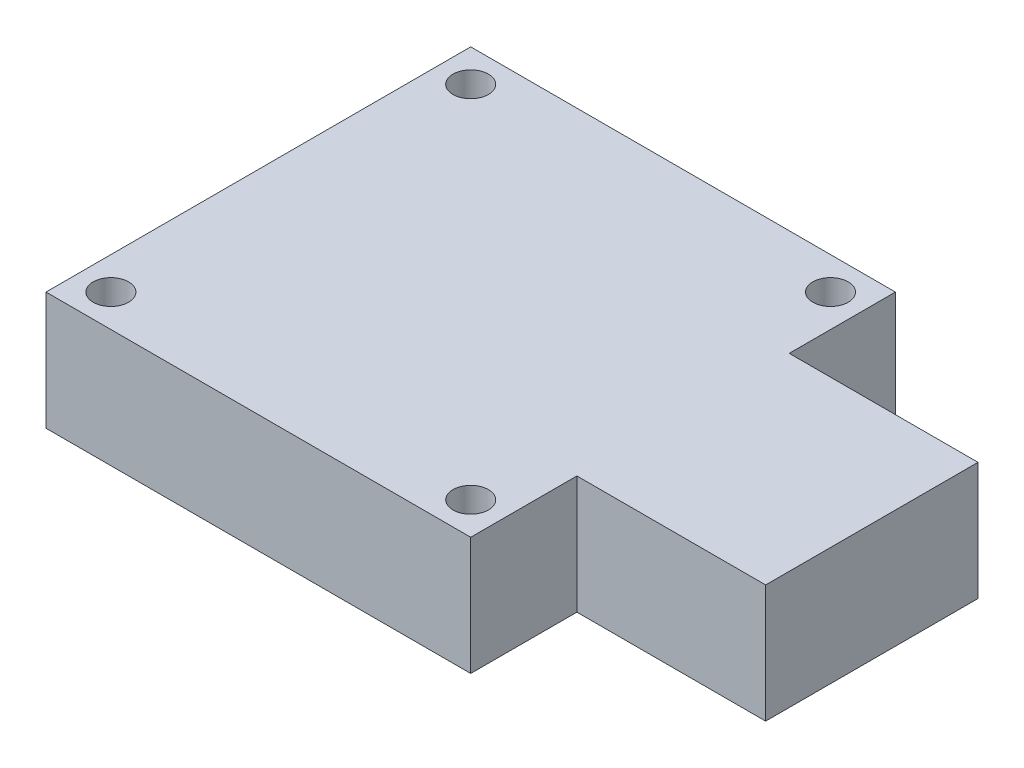
ISO-10303-21;
HEADER;
FILE_DESCRIPTION(('STEP AP214'),'2;1');
FILE_NAME('part.step','',(''),(''),'','','');
FILE_SCHEMA(('AUTOMOTIVE_DESIGN { 1 0 10303 214 1 1 1 1 }'));
ENDSEC;
DATA;
#1=APPLICATION_CONTEXT('core data for automotive mechanical design processes');
#2=APPLICATION_PROTOCOL_DEFINITION('international standard','automotive_design',2000,#1);
#3=PRODUCT_CONTEXT('',#1,'mechanical');
#4=PRODUCT('Part','Part','',(#3));
#5=PRODUCT_RELATED_PRODUCT_CATEGORY('part','',(#4));
#6=PRODUCT_DEFINITION_FORMATION('','',#4);
#7=PRODUCT_DEFINITION_CONTEXT('part definition',#1,'design');
#8=PRODUCT_DEFINITION('design','',#6,#7);
#9=PRODUCT_DEFINITION_SHAPE('','',#8);
#10=(LENGTH_UNIT() NAMED_UNIT(*) SI_UNIT(.MILLI.,.METRE.));
#11=(NAMED_UNIT(*) PLANE_ANGLE_UNIT() SI_UNIT($,.RADIAN.));
#12=(NAMED_UNIT(*) SI_UNIT($,.STERADIAN.) SOLID_ANGLE_UNIT());
#13=UNCERTAINTY_MEASURE_WITH_UNIT(LENGTH_MEASURE(1.E-05),#10,'distance_accuracy_value','');
#14=(GEOMETRIC_REPRESENTATION_CONTEXT(3) GLOBAL_UNCERTAINTY_ASSIGNED_CONTEXT((#13)) GLOBAL_UNIT_ASSIGNED_CONTEXT((#10,
#11,#12)) REPRESENTATION_CONTEXT('',''));
#15=CARTESIAN_POINT('',(0.,0.,0.));
#16=DIRECTION('',(0.,0.,1.));
#17=DIRECTION('',(1.,0.,0.));
#18=AXIS2_PLACEMENT_3D('',#15,#16,#17);
#19=CARTESIAN_POINT('',(-18.,10.,18.));
#20=DIRECTION('',(0.,0.,-1.));
#21=DIRECTION('',(-1.,0.,0.));
#22=AXIS2_PLACEMENT_3D('',#19,#20,#21);
#23=PLANE('',#22);
#24=DIRECTION('',(1.,0.,0.));
#25=VECTOR('',#24,1.);
#26=CARTESIAN_POINT('',(-18.,0.,18.));
#27=LINE('',#26,#25);
#28=CARTESIAN_POINT('',(-18.,0.,18.));
#29=VERTEX_POINT('',#28);
#30=CARTESIAN_POINT('',(18.,0.,18.));
#31=VERTEX_POINT('',#30);
#32=EDGE_CURVE('E135',#29,#31,#27,.T.);
#33=ORIENTED_EDGE('',*,*,#32,.T.);
#34=DIRECTION('',(0.,-1.,0.));
#35=VECTOR('',#34,1.);
#36=CARTESIAN_POINT('',(18.,10.,18.));
#37=LINE('',#36,#35);
#38=CARTESIAN_POINT('',(18.,10.,18.));
#39=VERTEX_POINT('',#38);
#40=EDGE_CURVE('E11',#39,#31,#37,.T.);
#41=ORIENTED_EDGE('',*,*,#40,.F.);
#42=DIRECTION('',(1.,0.,0.));
#43=VECTOR('',#42,1.);
#44=CARTESIAN_POINT('',(-18.,10.,18.));
#45=LINE('',#44,#43);
#46=CARTESIAN_POINT('',(-18.,10.,18.));
#47=VERTEX_POINT('',#46);
#48=EDGE_CURVE('E150',#47,#39,#45,.T.);
#49=ORIENTED_EDGE('',*,*,#48,.F.);
#50=DIRECTION('',(0.,-1.,0.));
#51=VECTOR('',#50,1.);
#52=CARTESIAN_POINT('',(-18.,10.,18.));
#53=LINE('',#52,#51);
#54=EDGE_CURVE('E131',#47,#29,#53,.T.);
#55=ORIENTED_EDGE('',*,*,#54,.T.);
#56=EDGE_LOOP('',(#33,#41,#49,#55));
#57=FACE_BOUND('',#56,.T.);
#58=ADVANCED_FACE('F39',(#57),#23,.F.);
#59=CARTESIAN_POINT('',(18.,10.,9.));
#60=DIRECTION('',(-1.,0.,0.));
#61=DIRECTION('',(0.,0.,1.));
#62=AXIS2_PLACEMENT_3D('',#59,#60,#61);
#63=PLANE('',#62);
#64=DIRECTION('',(0.,0.,-1.));
#65=VECTOR('',#64,1.);
#66=CARTESIAN_POINT('',(18.,0.,9.));
#67=LINE('',#66,#65);
#68=CARTESIAN_POINT('',(18.,0.,9.));
#69=VERTEX_POINT('',#68);
#70=EDGE_CURVE('E138',#31,#69,#67,.T.);
#71=ORIENTED_EDGE('',*,*,#70,.T.);
#72=DIRECTION('',(0.,-1.,0.));
#73=VECTOR('',#72,1.);
#74=CARTESIAN_POINT('',(18.,10.,9.));
#75=LINE('',#74,#73);
#76=CARTESIAN_POINT('',(18.,10.,9.));
#77=VERTEX_POINT('',#76);
#78=EDGE_CURVE('E47',#77,#69,#75,.T.);
#79=ORIENTED_EDGE('',*,*,#78,.F.);
#80=DIRECTION('',(0.,0.,-1.));
#81=VECTOR('',#80,1.);
#82=CARTESIAN_POINT('',(18.,10.,9.));
#83=LINE('',#82,#81);
#84=EDGE_CURVE('E98',#39,#77,#83,.T.);
#85=ORIENTED_EDGE('',*,*,#84,.F.);
#86=ORIENTED_EDGE('',*,*,#40,.T.);
#87=EDGE_LOOP('',(#71,#79,#85,#86));
#88=FACE_BOUND('',#87,.T.);
#89=ADVANCED_FACE('F232',(#88),#63,.F.);
#90=CARTESIAN_POINT('',(18.,10.,9.));
#91=DIRECTION('',(0.,0.,-1.));
#92=DIRECTION('',(-1.,0.,0.));
#93=AXIS2_PLACEMENT_3D('',#90,#91,#92);
#94=PLANE('',#93);
#95=DIRECTION('',(1.,0.,0.));
#96=VECTOR('',#95,1.);
#97=CARTESIAN_POINT('',(18.,0.,9.));
#98=LINE('',#97,#96);
#99=CARTESIAN_POINT('',(34.,0.,9.));
#100=VERTEX_POINT('',#99);
#101=EDGE_CURVE('E141',#69,#100,#98,.T.);
#102=ORIENTED_EDGE('',*,*,#101,.T.);
#103=DIRECTION('',(0.,-1.,0.));
#104=VECTOR('',#103,1.);
#105=CARTESIAN_POINT('',(34.,10.,9.));
#106=LINE('',#105,#104);
#107=CARTESIAN_POINT('',(34.,10.,9.));
#108=VERTEX_POINT('',#107);
#109=EDGE_CURVE('E157',#108,#100,#106,.T.);
#110=ORIENTED_EDGE('',*,*,#109,.F.);
#111=DIRECTION('',(1.,0.,0.));
#112=VECTOR('',#111,1.);
#113=CARTESIAN_POINT('',(18.,10.,9.));
#114=LINE('',#113,#112);
#115=EDGE_CURVE('E165',#77,#108,#114,.T.);
#116=ORIENTED_EDGE('',*,*,#115,.F.);
#117=ORIENTED_EDGE('',*,*,#78,.T.);
#118=EDGE_LOOP('',(#102,#110,#116,#117));
#119=FACE_BOUND('',#118,.T.);
#120=ADVANCED_FACE('F163',(#119),#94,.F.);
#121=CARTESIAN_POINT('',(34.,10.,-9.));
#122=DIRECTION('',(-1.,0.,0.));
#123=DIRECTION('',(0.,0.,1.));
#124=AXIS2_PLACEMENT_3D('',#121,#122,#123);
#125=PLANE('',#124);
#126=DIRECTION('',(0.,0.,-1.));
#127=VECTOR('',#126,1.);
#128=CARTESIAN_POINT('',(34.,0.,-9.));
#129=LINE('',#128,#127);
#130=CARTESIAN_POINT('',(34.,0.,-9.));
#131=VERTEX_POINT('',#130);
#132=EDGE_CURVE('E143',#100,#131,#129,.T.);
#133=ORIENTED_EDGE('',*,*,#132,.T.);
#134=DIRECTION('',(0.,-1.,0.));
#135=VECTOR('',#134,1.);
#136=CARTESIAN_POINT('',(34.,10.,-9.));
#137=LINE('',#136,#135);
#138=CARTESIAN_POINT('',(34.,10.,-9.));
#139=VERTEX_POINT('',#138);
#140=EDGE_CURVE('E154',#139,#131,#137,.T.);
#141=ORIENTED_EDGE('',*,*,#140,.F.);
#142=DIRECTION('',(0.,0.,-1.));
#143=VECTOR('',#142,1.);
#144=CARTESIAN_POINT('',(34.,10.,-9.));
#145=LINE('',#144,#143);
#146=EDGE_CURVE('E177',#108,#139,#145,.T.);
#147=ORIENTED_EDGE('',*,*,#146,.F.);
#148=ORIENTED_EDGE('',*,*,#109,.T.);
#149=EDGE_LOOP('',(#133,#141,#147,#148));
#150=FACE_BOUND('',#149,.T.);
#151=ADVANCED_FACE('F173',(#150),#125,.F.);
#152=CARTESIAN_POINT('',(18.,10.,-9.));
#153=DIRECTION('',(0.,0.,1.));
#154=DIRECTION('',(1.,0.,0.));
#155=AXIS2_PLACEMENT_3D('',#152,#153,#154);
#156=PLANE('',#155);
#157=DIRECTION('',(-1.,0.,0.));
#158=VECTOR('',#157,1.);
#159=CARTESIAN_POINT('',(18.,0.,-9.));
#160=LINE('',#159,#158);
#161=CARTESIAN_POINT('',(18.,0.,-9.));
#162=VERTEX_POINT('',#161);
#163=EDGE_CURVE('E145',#131,#162,#160,.T.);
#164=ORIENTED_EDGE('',*,*,#163,.T.);
#165=DIRECTION('',(0.,-1.,0.));
#166=VECTOR('',#165,1.);
#167=CARTESIAN_POINT('',(18.,10.,-9.));
#168=LINE('',#167,#166);
#169=CARTESIAN_POINT('',(18.,10.,-9.));
#170=VERTEX_POINT('',#169);
#171=EDGE_CURVE('E126',#170,#162,#168,.T.);
#172=ORIENTED_EDGE('',*,*,#171,.F.);
#173=DIRECTION('',(-1.,0.,0.));
#174=VECTOR('',#173,1.);
#175=CARTESIAN_POINT('',(18.,10.,-9.));
#176=LINE('',#175,#174);
#177=EDGE_CURVE('E117',#139,#170,#176,.T.);
#178=ORIENTED_EDGE('',*,*,#177,.F.);
#179=ORIENTED_EDGE('',*,*,#140,.T.);
#180=EDGE_LOOP('',(#164,#172,#178,#179));
#181=FACE_BOUND('',#180,.T.);
#182=ADVANCED_FACE('F176',(#181),#156,.F.);
#183=CARTESIAN_POINT('',(18.,10.,-18.));
#184=DIRECTION('',(-1.,0.,0.));
#185=DIRECTION('',(0.,0.,1.));
#186=AXIS2_PLACEMENT_3D('',#183,#184,#185);
#187=PLANE('',#186);
#188=DIRECTION('',(0.,0.,-1.));
#189=VECTOR('',#188,1.);
#190=CARTESIAN_POINT('',(18.,0.,-18.));
#191=LINE('',#190,#189);
#192=CARTESIAN_POINT('',(18.,0.,-18.));
#193=VERTEX_POINT('',#192);
#194=EDGE_CURVE('E125',#162,#193,#191,.T.);
#195=ORIENTED_EDGE('',*,*,#194,.T.);
#196=DIRECTION('',(0.,-1.,0.));
#197=VECTOR('',#196,1.);
#198=CARTESIAN_POINT('',(18.,10.,-18.));
#199=LINE('',#198,#197);
#200=CARTESIAN_POINT('',(18.,10.,-18.));
#201=VERTEX_POINT('',#200);
#202=EDGE_CURVE('E122',#201,#193,#199,.T.);
#203=ORIENTED_EDGE('',*,*,#202,.F.);
#204=DIRECTION('',(0.,0.,-1.));
#205=VECTOR('',#204,1.);
#206=CARTESIAN_POINT('',(18.,10.,-18.));
#207=LINE('',#206,#205);
#208=EDGE_CURVE('E111',#170,#201,#207,.T.);
#209=ORIENTED_EDGE('',*,*,#208,.F.);
#210=ORIENTED_EDGE('',*,*,#171,.T.);
#211=EDGE_LOOP('',(#195,#203,#209,#210));
#212=FACE_BOUND('',#211,.T.);
#213=ADVANCED_FACE('F123',(#212),#187,.F.);
#214=CARTESIAN_POINT('',(-18.,10.,-18.));
#215=DIRECTION('',(0.,0.,1.));
#216=DIRECTION('',(1.,0.,0.));
#217=AXIS2_PLACEMENT_3D('',#214,#215,#216);
#218=PLANE('',#217);
#219=DIRECTION('',(-1.,0.,0.));
#220=VECTOR('',#219,1.);
#221=CARTESIAN_POINT('',(-18.,0.,-18.));
#222=LINE('',#221,#220);
#223=CARTESIAN_POINT('',(-18.,0.,-18.));
#224=VERTEX_POINT('',#223);
#225=EDGE_CURVE('E84',#193,#224,#222,.T.);
#226=ORIENTED_EDGE('',*,*,#225,.T.);
#227=DIRECTION('',(0.,-1.,0.));
#228=VECTOR('',#227,1.);
#229=CARTESIAN_POINT('',(-18.,10.,-18.));
#230=LINE('',#229,#228);
#231=CARTESIAN_POINT('',(-18.,10.,-18.));
#232=VERTEX_POINT('',#231);
#233=EDGE_CURVE('E127',#232,#224,#230,.T.);
#234=ORIENTED_EDGE('',*,*,#233,.F.);
#235=DIRECTION('',(-1.,0.,0.));
#236=VECTOR('',#235,1.);
#237=CARTESIAN_POINT('',(-18.,10.,-18.));
#238=LINE('',#237,#236);
#239=EDGE_CURVE('E115',#201,#232,#238,.T.);
#240=ORIENTED_EDGE('',*,*,#239,.F.);
#241=ORIENTED_EDGE('',*,*,#202,.T.);
#242=EDGE_LOOP('',(#226,#234,#240,#241));
#243=FACE_BOUND('',#242,.T.);
#244=ADVANCED_FACE('F129',(#243),#218,.F.);
#245=CARTESIAN_POINT('',(-18.,10.,-18.));
#246=DIRECTION('',(1.,0.,0.));
#247=DIRECTION('',(0.,0.,-1.));
#248=AXIS2_PLACEMENT_3D('',#245,#246,#247);
#249=PLANE('',#248);
#250=DIRECTION('',(0.,0.,1.));
#251=VECTOR('',#250,1.);
#252=CARTESIAN_POINT('',(-18.,0.,-18.));
#253=LINE('',#252,#251);
#254=EDGE_CURVE('E90',#224,#29,#253,.T.);
#255=ORIENTED_EDGE('',*,*,#254,.T.);
#256=ORIENTED_EDGE('',*,*,#54,.F.);
#257=DIRECTION('',(0.,0.,1.));
#258=VECTOR('',#257,1.);
#259=CARTESIAN_POINT('',(-18.,10.,-18.));
#260=LINE('',#259,#258);
#261=EDGE_CURVE('E55',#232,#47,#260,.T.);
#262=ORIENTED_EDGE('',*,*,#261,.F.);
#263=ORIENTED_EDGE('',*,*,#233,.T.);
#264=EDGE_LOOP('',(#255,#256,#262,#263));
#265=FACE_BOUND('',#264,.T.);
#266=ADVANCED_FACE('F211',(#265),#249,.F.);
#267=CARTESIAN_POINT('',(0.,10.,0.));
#268=DIRECTION('',(0.,-1.,0.));
#269=DIRECTION('',(0.,0.,-1.));
#270=AXIS2_PLACEMENT_3D('',#267,#268,#269);
#271=PLANE('',#270);
#272=CARTESIAN_POINT('',(15.25,10.,-15.25));
#273=DIRECTION('',(0.,1.,0.));
#274=DIRECTION('',(0.,0.,1.));
#275=AXIS2_PLACEMENT_3D('',#272,#273,#274);
#276=CIRCLE('',#275,1.5);
#277=CARTESIAN_POINT('',(15.25,10.,-13.75));
#278=VERTEX_POINT('',#277);
#279=EDGE_CURVE('E186',#278,#278,#276,.T.);
#280=ORIENTED_EDGE('',*,*,#279,.F.);
#281=EDGE_LOOP('',(#280));
#282=FACE_BOUND('',#281,.T.);
#283=CARTESIAN_POINT('',(-15.25,10.,15.25));
#284=DIRECTION('',(0.,1.,0.));
#285=DIRECTION('',(0.,0.,1.));
#286=AXIS2_PLACEMENT_3D('',#283,#284,#285);
#287=CIRCLE('',#286,1.5);
#288=CARTESIAN_POINT('',(-15.25,10.,16.75));
#289=VERTEX_POINT('',#288);
#290=EDGE_CURVE('E192',#289,#289,#287,.T.);
#291=ORIENTED_EDGE('',*,*,#290,.F.);
#292=EDGE_LOOP('',(#291));
#293=FACE_BOUND('',#292,.T.);
#294=CARTESIAN_POINT('',(15.25,10.,15.25));
#295=DIRECTION('',(0.,1.,0.));
#296=DIRECTION('',(0.,0.,1.));
#297=AXIS2_PLACEMENT_3D('',#294,#295,#296);
#298=CIRCLE('',#297,1.5);
#299=CARTESIAN_POINT('',(15.25,10.,16.75));
#300=VERTEX_POINT('',#299);
#301=EDGE_CURVE('E193',#300,#300,#298,.T.);
#302=ORIENTED_EDGE('',*,*,#301,.F.);
#303=EDGE_LOOP('',(#302));
#304=FACE_BOUND('',#303,.T.);
#305=CARTESIAN_POINT('',(-15.25,10.,-15.25));
#306=DIRECTION('',(0.,1.,0.));
#307=DIRECTION('',(0.,0.,1.));
#308=AXIS2_PLACEMENT_3D('',#305,#306,#307);
#309=CIRCLE('',#308,1.5);
#310=CARTESIAN_POINT('',(-15.25,10.,-13.75));
#311=VERTEX_POINT('',#310);
#312=EDGE_CURVE('E183',#311,#311,#309,.T.);
#313=ORIENTED_EDGE('',*,*,#312,.F.);
#314=EDGE_LOOP('',(#313));
#315=FACE_BOUND('',#314,.T.);
#316=ORIENTED_EDGE('',*,*,#48,.T.);
#317=ORIENTED_EDGE('',*,*,#84,.T.);
#318=ORIENTED_EDGE('',*,*,#115,.T.);
#319=ORIENTED_EDGE('',*,*,#146,.T.);
#320=ORIENTED_EDGE('',*,*,#177,.T.);
#321=ORIENTED_EDGE('',*,*,#208,.T.);
#322=ORIENTED_EDGE('',*,*,#239,.T.);
#323=ORIENTED_EDGE('',*,*,#261,.T.);
#324=EDGE_LOOP('',(#316,#317,#318,#319,#320,#321,#322,#323));
#325=FACE_BOUND('',#324,.T.);
#326=ADVANCED_FACE('F113',(#282,#293,#304,#315,#325),#271,.F.);
#327=CARTESIAN_POINT('',(0.,0.,0.));
#328=DIRECTION('',(0.,-1.,0.));
#329=DIRECTION('',(0.,0.,-1.));
#330=AXIS2_PLACEMENT_3D('',#327,#328,#329);
#331=PLANE('',#330);
#332=CARTESIAN_POINT('',(15.25,0.,-15.25));
#333=DIRECTION('',(0.,1.,0.));
#334=DIRECTION('',(0.,0.,1.));
#335=AXIS2_PLACEMENT_3D('',#332,#333,#334);
#336=CIRCLE('',#335,1.5);
#337=CARTESIAN_POINT('',(15.25,0.,-13.75));
#338=VERTEX_POINT('',#337);
#339=EDGE_CURVE('E196',#338,#338,#336,.T.);
#340=ORIENTED_EDGE('',*,*,#339,.T.);
#341=EDGE_LOOP('',(#340));
#342=FACE_BOUND('',#341,.T.);
#343=CARTESIAN_POINT('',(-15.25,0.,15.25));
#344=DIRECTION('',(0.,1.,0.));
#345=DIRECTION('',(0.,0.,1.));
#346=AXIS2_PLACEMENT_3D('',#343,#344,#345);
#347=CIRCLE('',#346,1.5);
#348=CARTESIAN_POINT('',(-15.25,0.,16.75));
#349=VERTEX_POINT('',#348);
#350=EDGE_CURVE('E189',#349,#349,#347,.T.);
#351=ORIENTED_EDGE('',*,*,#350,.T.);
#352=EDGE_LOOP('',(#351));
#353=FACE_BOUND('',#352,.T.);
#354=CARTESIAN_POINT('',(15.25,0.,15.25));
#355=DIRECTION('',(0.,1.,0.));
#356=DIRECTION('',(0.,0.,1.));
#357=AXIS2_PLACEMENT_3D('',#354,#355,#356);
#358=CIRCLE('',#357,1.5);
#359=CARTESIAN_POINT('',(15.25,0.,16.75));
#360=VERTEX_POINT('',#359);
#361=EDGE_CURVE('E201',#360,#360,#358,.T.);
#362=ORIENTED_EDGE('',*,*,#361,.T.);
#363=EDGE_LOOP('',(#362));
#364=FACE_BOUND('',#363,.T.);
#365=CARTESIAN_POINT('',(-15.25,0.,-15.25));
#366=DIRECTION('',(0.,1.,0.));
#367=DIRECTION('',(0.,0.,1.));
#368=AXIS2_PLACEMENT_3D('',#365,#366,#367);
#369=CIRCLE('',#368,1.5);
#370=CARTESIAN_POINT('',(-15.25,0.,-13.75));
#371=VERTEX_POINT('',#370);
#372=EDGE_CURVE('E139',#371,#371,#369,.T.);
#373=ORIENTED_EDGE('',*,*,#372,.T.);
#374=EDGE_LOOP('',(#373));
#375=FACE_BOUND('',#374,.T.);
#376=ORIENTED_EDGE('',*,*,#32,.F.);
#377=ORIENTED_EDGE('',*,*,#254,.F.);
#378=ORIENTED_EDGE('',*,*,#225,.F.);
#379=ORIENTED_EDGE('',*,*,#194,.F.);
#380=ORIENTED_EDGE('',*,*,#163,.F.);
#381=ORIENTED_EDGE('',*,*,#132,.F.);
#382=ORIENTED_EDGE('',*,*,#101,.F.);
#383=ORIENTED_EDGE('',*,*,#70,.F.);
#384=EDGE_LOOP('',(#376,#377,#378,#379,#380,#381,#382,#383));
#385=FACE_BOUND('',#384,.T.);
#386=ADVANCED_FACE('F169',(#342,#353,#364,#375,#385),#331,.T.);
#387=CARTESIAN_POINT('',(-15.25,0.,-15.25));
#388=DIRECTION('',(0.,1.,0.));
#389=DIRECTION('',(0.,0.,1.));
#390=AXIS2_PLACEMENT_3D('',#387,#388,#389);
#391=CYLINDRICAL_SURFACE('',#390,1.5);
#392=ORIENTED_EDGE('',*,*,#372,.F.);
#393=EDGE_LOOP('',(#392));
#394=FACE_BOUND('',#393,.T.);
#395=ORIENTED_EDGE('',*,*,#312,.T.);
#396=EDGE_LOOP('',(#395));
#397=FACE_BOUND('',#396,.T.);
#398=ADVANCED_FACE('F216',(#394,#397),#391,.F.);
#399=CARTESIAN_POINT('',(15.25,0.,15.25));
#400=DIRECTION('',(0.,1.,0.));
#401=DIRECTION('',(0.,0.,1.));
#402=AXIS2_PLACEMENT_3D('',#399,#400,#401);
#403=CYLINDRICAL_SURFACE('',#402,1.5);
#404=ORIENTED_EDGE('',*,*,#361,.F.);
#405=EDGE_LOOP('',(#404));
#406=FACE_BOUND('',#405,.T.);
#407=ORIENTED_EDGE('',*,*,#301,.T.);
#408=EDGE_LOOP('',(#407));
#409=FACE_BOUND('',#408,.T.);
#410=ADVANCED_FACE('F207',(#406,#409),#403,.F.);
#411=CARTESIAN_POINT('',(-15.25,0.,15.25));
#412=DIRECTION('',(0.,1.,0.));
#413=DIRECTION('',(0.,0.,1.));
#414=AXIS2_PLACEMENT_3D('',#411,#412,#413);
#415=CYLINDRICAL_SURFACE('',#414,1.5);
#416=ORIENTED_EDGE('',*,*,#350,.F.);
#417=EDGE_LOOP('',(#416));
#418=FACE_BOUND('',#417,.T.);
#419=ORIENTED_EDGE('',*,*,#290,.T.);
#420=EDGE_LOOP('',(#419));
#421=FACE_BOUND('',#420,.T.);
#422=ADVANCED_FACE('F224',(#418,#421),#415,.F.);
#423=CARTESIAN_POINT('',(15.25,0.,-15.25));
#424=DIRECTION('',(0.,1.,0.));
#425=DIRECTION('',(0.,0.,1.));
#426=AXIS2_PLACEMENT_3D('',#423,#424,#425);
#427=CYLINDRICAL_SURFACE('',#426,1.5);
#428=ORIENTED_EDGE('',*,*,#339,.F.);
#429=EDGE_LOOP('',(#428));
#430=FACE_BOUND('',#429,.T.);
#431=ORIENTED_EDGE('',*,*,#279,.T.);
#432=EDGE_LOOP('',(#431));
#433=FACE_BOUND('',#432,.T.);
#434=ADVANCED_FACE('F313',(#430,#433),#427,.F.);
#435=CLOSED_SHELL('',(#58,#89,#120,#151,#182,#213,#244,#266,#326,#386,#398,#410,#422,#434));
#436=MANIFOLD_SOLID_BREP('B2',#435);
#437=ADVANCED_BREP_SHAPE_REPRESENTATION('',(#18,#436),#14);
#438=SHAPE_DEFINITION_REPRESENTATION(#9,#437);
ENDSEC;
END-ISO-10303-21;
